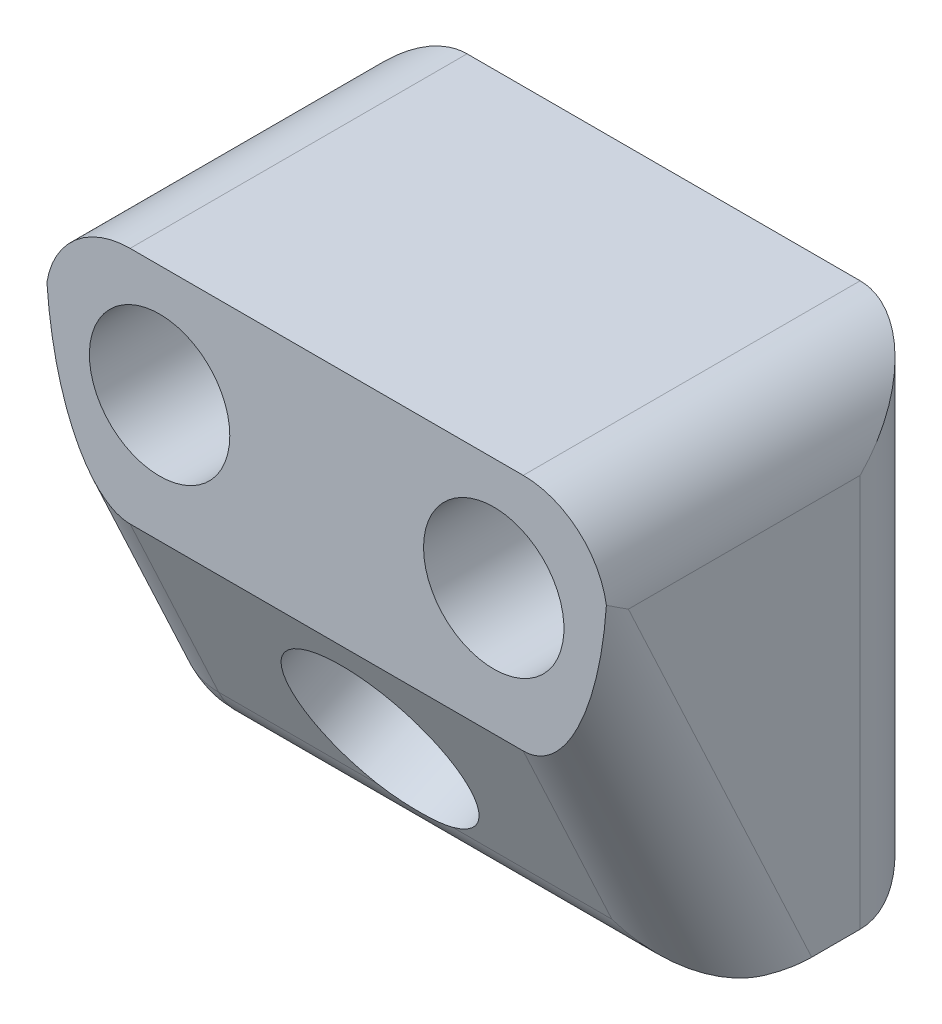
ISO-10303-21;
HEADER;
FILE_DESCRIPTION(('STEP AP214'),'2;1');
FILE_NAME('part.step','',(''),(''),'','','');
FILE_SCHEMA(('AUTOMOTIVE_DESIGN { 1 0 10303 214 1 1 1 1 }'));
ENDSEC;
DATA;
#1=APPLICATION_CONTEXT('core data for automotive mechanical design processes');
#2=APPLICATION_PROTOCOL_DEFINITION('international standard','automotive_design',2000,#1);
#3=PRODUCT_CONTEXT('',#1,'mechanical');
#4=PRODUCT('Part','Part','',(#3));
#5=PRODUCT_RELATED_PRODUCT_CATEGORY('part','',(#4));
#6=PRODUCT_DEFINITION_FORMATION('','',#4);
#7=PRODUCT_DEFINITION_CONTEXT('part definition',#1,'design');
#8=PRODUCT_DEFINITION('design','',#6,#7);
#9=PRODUCT_DEFINITION_SHAPE('','',#8);
#10=(LENGTH_UNIT() NAMED_UNIT(*) SI_UNIT(.MILLI.,.METRE.));
#11=(NAMED_UNIT(*) PLANE_ANGLE_UNIT() SI_UNIT($,.RADIAN.));
#12=(NAMED_UNIT(*) SI_UNIT($,.STERADIAN.) SOLID_ANGLE_UNIT());
#13=UNCERTAINTY_MEASURE_WITH_UNIT(LENGTH_MEASURE(1.E-05),#10,'distance_accuracy_value','');
#14=(GEOMETRIC_REPRESENTATION_CONTEXT(3) GLOBAL_UNCERTAINTY_ASSIGNED_CONTEXT((#13)) GLOBAL_UNIT_ASSIGNED_CONTEXT((#10,
#11,#12)) REPRESENTATION_CONTEXT('',''));
#15=CARTESIAN_POINT('',(0.,0.,0.));
#16=DIRECTION('',(0.,0.,1.));
#17=DIRECTION('',(1.,0.,0.));
#18=AXIS2_PLACEMENT_3D('',#15,#16,#17);
#19=CARTESIAN_POINT('',(0.,0.,0.));
#20=DIRECTION('',(0.,0.,1.));
#21=DIRECTION('',(1.,0.,0.));
#22=AXIS2_PLACEMENT_3D('',#19,#20,#21);
#23=PLANE('',#22);
#24=CARTESIAN_POINT('',(-40.4144473670726,10.6456692913386,0.));
#25=DIRECTION('',(0.,0.,1.));
#26=DIRECTION('',(1.,0.,0.));
#27=AXIS2_PLACEMENT_3D('',#24,#25,#26);
#28=CIRCLE('',#27,2.5);
#29=CARTESIAN_POINT('',(-41.4644473670726,8.37685903043088,0.));
#30=VERTEX_POINT('',#29);
#31=CARTESIAN_POINT('',(-41.4644473670726,12.9144795522463,0.));
#32=VERTEX_POINT('',#31);
#33=EDGE_CURVE('E230',#30,#32,#28,.T.);
#34=ORIENTED_EDGE('',*,*,#33,.T.);
#35=DIRECTION('',(0.,-1.,0.));
#36=VECTOR('',#35,1.);
#37=CARTESIAN_POINT('',(-41.4644473670726,0.,0.));
#38=LINE('',#37,#36);
#39=CARTESIAN_POINT('',(-41.4644473670726,14.6456692913386,0.));
#40=VERTEX_POINT('',#39);
#41=EDGE_CURVE('E278',#32,#40,#38,.F.);
#42=ORIENTED_EDGE('',*,*,#41,.T.);
#43=DIRECTION('',(-1.,0.,0.));
#44=VECTOR('',#43,1.);
#45=CARTESIAN_POINT('',(-44.4644473670726,14.6456692913386,0.));
#46=LINE('',#45,#44);
#47=CARTESIAN_POINT('',(-27.4644473670726,14.6456692913386,0.));
#48=VERTEX_POINT('',#47);
#49=EDGE_CURVE('E236',#48,#40,#46,.T.);
#50=ORIENTED_EDGE('',*,*,#49,.F.);
#51=DIRECTION('',(0.,1.,0.));
#52=VECTOR('',#51,1.);
#53=CARTESIAN_POINT('',(-27.4644473670726,0.,0.));
#54=LINE('',#53,#52);
#55=CARTESIAN_POINT('',(-27.4644473670726,12.9144795522463,0.));
#56=VERTEX_POINT('',#55);
#57=EDGE_CURVE('E276',#48,#56,#54,.F.);
#58=ORIENTED_EDGE('',*,*,#57,.T.);
#59=CARTESIAN_POINT('',(-28.5144473670726,10.6456692913386,0.));
#60=DIRECTION('',(0.,0.,1.));
#61=DIRECTION('',(-1.,0.,0.));
#62=AXIS2_PLACEMENT_3D('',#59,#60,#61);
#63=CIRCLE('',#62,2.5);
#64=CARTESIAN_POINT('',(-27.4644473670726,8.37685903043088,0.));
#65=VERTEX_POINT('',#64);
#66=EDGE_CURVE('E226',#56,#65,#63,.T.);
#67=ORIENTED_EDGE('',*,*,#66,.T.);
#68=DIRECTION('',(0.,1.,0.));
#69=VECTOR('',#68,1.);
#70=CARTESIAN_POINT('',(-27.4644473670726,0.,0.));
#71=LINE('',#70,#69);
#72=CARTESIAN_POINT('',(-27.4644473670726,0.645669291338572,0.));
#73=VERTEX_POINT('',#72);
#74=EDGE_CURVE('E269',#65,#73,#71,.F.);
#75=ORIENTED_EDGE('',*,*,#74,.T.);
#76=DIRECTION('',(1.,0.,0.));
#77=VECTOR('',#76,1.);
#78=CARTESIAN_POINT('',(0.,0.645669291338572,0.));
#79=LINE('',#78,#77);
#80=CARTESIAN_POINT('',(-41.4644473670726,0.645669291338572,0.));
#81=VERTEX_POINT('',#80);
#82=EDGE_CURVE('E271',#73,#81,#79,.F.);
#83=ORIENTED_EDGE('',*,*,#82,.T.);
#84=DIRECTION('',(0.,-1.,0.));
#85=VECTOR('',#84,1.);
#86=CARTESIAN_POINT('',(-41.4644473670726,0.,0.));
#87=LINE('',#86,#85);
#88=EDGE_CURVE('E274',#81,#30,#87,.F.);
#89=ORIENTED_EDGE('',*,*,#88,.T.);
#90=EDGE_LOOP('',(#34,#42,#50,#58,#67,#75,#83,#89));
#91=FACE_BOUND('',#90,.T.);
#92=DIRECTION('',(0.4636228302904,-0.886032658107769,0.));
#93=VECTOR('',#92,1.);
#94=CARTESIAN_POINT('',(-20.4655939879077,-10.7087662304812,0.));
#95=LINE('',#94,#93);
#96=CARTESIAN_POINT('',(-32.0395762364762,11.4103478135097,0.));
#97=VERTEX_POINT('',#96);
#98=CARTESIAN_POINT('',(-29.6147051058797,6.77616055386726,0.));
#99=VERTEX_POINT('',#98);
#100=EDGE_CURVE('E180',#97,#99,#95,.T.);
#101=ORIENTED_EDGE('',*,*,#100,.F.);
#102=DIRECTION('',(1.,0.,0.));
#103=VECTOR('',#102,1.);
#104=CARTESIAN_POINT('',(0.,11.4103478135097,0.));
#105=LINE('',#104,#103);
#106=CARTESIAN_POINT('',(-36.889318497669,11.4103478135097,0.));
#107=VERTEX_POINT('',#106);
#108=EDGE_CURVE('E246',#107,#97,#105,.T.);
#109=ORIENTED_EDGE('',*,*,#108,.F.);
#110=DIRECTION('',(0.463622830290399,0.88603265810777,0.));
#111=VECTOR('',#110,1.);
#112=CARTESIAN_POINT('',(-33.6473016629807,17.6061876341453,0.));
#113=LINE('',#112,#111);
#114=CARTESIAN_POINT('',(-39.3141896282654,6.77616055386726,0.));
#115=VERTEX_POINT('',#114);
#116=EDGE_CURVE('E250',#115,#107,#113,.T.);
#117=ORIENTED_EDGE('',*,*,#116,.F.);
#118=DIRECTION('',(-0.4636228302904,0.886032658107769,0.));
#119=VECTOR('',#118,1.);
#120=CARTESIAN_POINT('',(-28.0802118611763,-14.6931686762376,0.));
#121=LINE('',#120,#119);
#122=CARTESIAN_POINT('',(-36.889318497669,2.14197329422482,0.));
#123=VERTEX_POINT('',#122);
#124=EDGE_CURVE('E253',#123,#115,#121,.T.);
#125=ORIENTED_EDGE('',*,*,#124,.F.);
#126=DIRECTION('',(-1.,0.,0.));
#127=VECTOR('',#126,1.);
#128=CARTESIAN_POINT('',(0.,2.14197329422481,0.));
#129=LINE('',#128,#127);
#130=CARTESIAN_POINT('',(-32.0395762364762,2.14197329422481,0.));
#131=VERTEX_POINT('',#130);
#132=EDGE_CURVE('E255',#131,#123,#129,.T.);
#133=ORIENTED_EDGE('',*,*,#132,.F.);
#134=DIRECTION('',(-0.4636228302904,-0.886032658107769,0.));
#135=VECTOR('',#134,1.);
#136=CARTESIAN_POINT('',(-26.0326837897121,13.621785188389,0.));
#137=LINE('',#136,#135);
#138=EDGE_CURVE('E257',#99,#131,#137,.T.);
#139=ORIENTED_EDGE('',*,*,#138,.F.);
#140=EDGE_LOOP('',(#101,#109,#117,#125,#133,#139));
#141=FACE_BOUND('',#140,.T.);
#142=ADVANCED_FACE('F33',(#91,#141),#23,.F.);
#143=CARTESIAN_POINT('',(-34.4644473670726,10.5196494844875,-8.02793791856618));
#144=DIRECTION('',(0.,-0.422618261740694,0.906307787036653));
#145=DIRECTION('',(0.,-0.906307787036653,-0.422618261740694));
#146=AXIS2_PLACEMENT_3D('',#143,#144,#145);
#147=CYLINDRICAL_SURFACE('',#146,3.25);
#148=CARTESIAN_POINT('',(-34.4644473670726,2.06728424967364,10.0982178221669));
#149=DIRECTION('',(0.,0.422618261740694,-0.906307787036652));
#150=DIRECTION('',(0.,0.906307787036652,0.422618261740694));
#151=AXIS2_PLACEMENT_3D('',#148,#149,#150);
#152=CIRCLE('',#151,3.25);
#153=CARTESIAN_POINT('',(-35.7897528702737,-0.622185493883504,8.84409748437003));
#154=VERTEX_POINT('',#153);
#155=CARTESIAN_POINT('',(-33.1391418638715,-0.622185493883504,8.84409748437003));
#156=VERTEX_POINT('',#155);
#157=EDGE_CURVE('E220',#154,#156,#152,.T.);
#158=ORIENTED_EDGE('',*,*,#157,.F.);
#159=CARTESIAN_POINT('',(-35.7897528702737,-0.622185493883504,8.84409748437003));
#160=CARTESIAN_POINT('',(-35.7064009194639,-0.655922594509591,8.82833929196015));
#161=CARTESIAN_POINT('',(-35.6214796240061,-0.686185258662031,8.81348777113793));
#162=CARTESIAN_POINT('',(-35.449112774626,-0.739846043116224,8.78624370417459));
#163=CARTESIAN_POINT('',(-35.3616672861628,-0.763244341254242,8.77385109433274));
#164=CARTESIAN_POINT('',(-35.1848711780588,-0.803260407212151,8.75217071075625));
#165=CARTESIAN_POINT('',(-35.0955207550009,-0.819878871158265,8.74288261827988));
#166=CARTESIAN_POINT('',(-34.9155378865713,-0.846402142187462,8.72785702442064));
#167=CARTESIAN_POINT('',(-34.8249055019709,-0.85630726643452,8.72211935530322));
#168=CARTESIAN_POINT('',(-34.6429186086016,-0.869450606502847,8.71447309843761));
#169=CARTESIAN_POINT('',(-34.5515635430502,-0.872683048526374,8.71256782685684));
#170=CARTESIAN_POINT('',(-34.368863545242,-0.872476851743304,8.71268882138494));
#171=CARTESIAN_POINT('',(-34.2775186129831,-0.869038214373278,8.71471508664716));
#172=CARTESIAN_POINT('',(-34.0956073916761,-0.855484472837947,8.72259573927654));
#173=CARTESIAN_POINT('',(-34.0050402715182,-0.845377726095767,8.728445334617));
#174=CARTESIAN_POINT('',(-33.8252421581059,-0.818460124402204,8.74367773012892));
#175=CARTESIAN_POINT('',(-33.7360107028926,-0.80165164565734,8.75305927792435));
#176=CARTESIAN_POINT('',(-33.5606544843802,-0.761535448388546,8.77475834520401));
#177=CARTESIAN_POINT('',(-33.4745041654263,-0.738317340823053,8.78703506604438));
#178=CARTESIAN_POINT('',(-33.3047785162481,-0.685244722024231,8.81395001929086));
#179=CARTESIAN_POINT('',(-33.2211999770614,-0.655398897498184,8.8285851537848));
#180=CARTESIAN_POINT('',(-33.1391418638715,-0.622185493883509,8.84409748437004));
#181=B_SPLINE_CURVE_WITH_KNOTS('',3,(#159,#160,#161,#162,#163,#164,#165,#166,#167,#168,#169,
#170,#171,#172,#173,#174,#175,#176,#177,#178,#179,#180),.UNSPECIFIED.,.F.,.F.,(4,2,2,2,2,2,2,2,
2,2,4),(0.,0.273779855338668,0.547552617190878,0.821297262073434,1.09502897330499,
1.36899744242814,1.64296585255407,1.91659153714566,2.19012028951803,2.46000332048648,
2.72953469171393),.UNSPECIFIED.);
#182=EDGE_CURVE('E309',#154,#156,#181,.T.);
#183=ORIENTED_EDGE('',*,*,#182,.T.);
#184=EDGE_LOOP('',(#158,#183));
#185=FACE_BOUND('',#184,.T.);
#186=CARTESIAN_POINT('',(-34.4644473670726,3.75775729663641,6.47298667402026));
#187=DIRECTION('',(0.,0.422618261740694,-0.906307787036653));
#188=DIRECTION('',(0.,0.906307787036653,0.422618261740694));
#189=AXIS2_PLACEMENT_3D('',#186,#187,#188);
#190=CIRCLE('',#189,3.25);
#191=CARTESIAN_POINT('',(-34.4644473670726,6.70325760450553,7.84649602467752));
#192=VERTEX_POINT('',#191);
#193=EDGE_CURVE('E183',#192,#192,#190,.T.);
#194=ORIENTED_EDGE('',*,*,#193,.T.);
#195=EDGE_LOOP('',(#194));
#196=FACE_BOUND('',#195,.T.);
#197=ADVANCED_FACE('F324',(#185,#196),#147,.F.);
#198=CARTESIAN_POINT('',(0.,0.,12.));
#199=DIRECTION('',(0.,0.,1.));
#200=DIRECTION('',(1.,0.,0.));
#201=AXIS2_PLACEMENT_3D('',#198,#199,#200);
#202=PLANE('',#201);
#203=CARTESIAN_POINT('',(-41.4644473670726,11.6456692913386,12.));
#204=DIRECTION('',(0.,0.,1.));
#205=DIRECTION('',(1.,0.,0.));
#206=AXIS2_PLACEMENT_3D('',#203,#204,#205);
#207=CIRCLE('',#206,3.);
#208=CARTESIAN_POINT('',(-41.4644473670726,14.6456692913386,12.));
#209=VERTEX_POINT('',#208);
#210=CARTESIAN_POINT('',(-44.426620762828,12.1205679894612,12.));
#211=VERTEX_POINT('',#210);
#212=EDGE_CURVE('E293',#209,#211,#207,.T.);
#213=ORIENTED_EDGE('',*,*,#212,.T.);
#214=CARTESIAN_POINT('',(-41.4644473670726,13.2442740407962,12.));
#215=DIRECTION('',(0.,0.,1.));
#216=DIRECTION('',(0.,1.,0.));
#217=AXIS2_PLACEMENT_3D('',#214,#215,#216);
#218=ELLIPSE('',#217,7.09860474945759,3.);
#219=CARTESIAN_POINT('',(-41.4644473670726,6.14566929133857,12.));
#220=VERTEX_POINT('',#219);
#221=EDGE_CURVE('E295',#211,#220,#218,.T.);
#222=ORIENTED_EDGE('',*,*,#221,.T.);
#223=DIRECTION('',(1.,0.,0.));
#224=VECTOR('',#223,1.);
#225=CARTESIAN_POINT('',(-44.4644473670726,6.14566929133857,12.));
#226=LINE('',#225,#224);
#227=CARTESIAN_POINT('',(-27.4644473670726,6.14566929133857,12.));
#228=VERTEX_POINT('',#227);
#229=EDGE_CURVE('E223',#220,#228,#226,.T.);
#230=ORIENTED_EDGE('',*,*,#229,.T.);
#231=CARTESIAN_POINT('',(-27.4644473670726,13.2442740407962,12.));
#232=DIRECTION('',(0.,0.,1.));
#233=DIRECTION('',(0.,1.,0.));
#234=AXIS2_PLACEMENT_3D('',#231,#232,#233);
#235=ELLIPSE('',#234,7.09860474945759,3.);
#236=CARTESIAN_POINT('',(-24.5022739713171,12.1205679894612,12.));
#237=VERTEX_POINT('',#236);
#238=EDGE_CURVE('E291',#228,#237,#235,.T.);
#239=ORIENTED_EDGE('',*,*,#238,.T.);
#240=CARTESIAN_POINT('',(-27.4644473670726,11.6456692913386,12.));
#241=DIRECTION('',(0.,0.,1.));
#242=DIRECTION('',(1.,0.,0.));
#243=AXIS2_PLACEMENT_3D('',#240,#241,#242);
#244=CIRCLE('',#243,3.);
#245=CARTESIAN_POINT('',(-27.4644473670726,14.6456692913386,12.));
#246=VERTEX_POINT('',#245);
#247=EDGE_CURVE('E289',#237,#246,#244,.T.);
#248=ORIENTED_EDGE('',*,*,#247,.T.);
#249=DIRECTION('',(-1.,0.,0.));
#250=VECTOR('',#249,1.);
#251=CARTESIAN_POINT('',(-44.4644473670726,14.6456692913386,12.));
#252=LINE('',#251,#250);
#253=EDGE_CURVE('E239',#246,#209,#252,.T.);
#254=ORIENTED_EDGE('',*,*,#253,.T.);
#255=EDGE_LOOP('',(#213,#222,#230,#239,#248,#254));
#256=FACE_BOUND('',#255,.T.);
#257=CARTESIAN_POINT('',(-40.4144473670726,10.6456692913386,12.));
#258=DIRECTION('',(0.,0.,1.));
#259=DIRECTION('',(1.,0.,0.));
#260=AXIS2_PLACEMENT_3D('',#257,#258,#259);
#261=CIRCLE('',#260,2.5);
#262=CARTESIAN_POINT('',(-37.9144473670726,10.6456692913386,12.));
#263=VERTEX_POINT('',#262);
#264=EDGE_CURVE('E233',#263,#263,#261,.T.);
#265=ORIENTED_EDGE('',*,*,#264,.F.);
#266=EDGE_LOOP('',(#265));
#267=FACE_BOUND('',#266,.T.);
#268=CARTESIAN_POINT('',(-28.5144473670726,10.6456692913386,12.));
#269=DIRECTION('',(0.,0.,1.));
#270=DIRECTION('',(-1.,0.,0.));
#271=AXIS2_PLACEMENT_3D('',#268,#269,#270);
#272=CIRCLE('',#271,2.5);
#273=CARTESIAN_POINT('',(-31.0144473670726,10.6456692913386,12.));
#274=VERTEX_POINT('',#273);
#275=EDGE_CURVE('E227',#274,#274,#272,.T.);
#276=ORIENTED_EDGE('',*,*,#275,.F.);
#277=EDGE_LOOP('',(#276));
#278=FACE_BOUND('',#277,.T.);
#279=ADVANCED_FACE('F388',(#256,#267,#278),#202,.T.);
#280=CARTESIAN_POINT('',(-24.4644473670726,14.6456692913386,12.));
#281=DIRECTION('',(-1.,0.,0.));
#282=DIRECTION('',(0.,-1.,0.));
#283=AXIS2_PLACEMENT_3D('',#280,#281,#282);
#284=PLANE('',#283);
#285=DIRECTION('',(0.,0.,-1.));
#286=VECTOR('',#285,1.);
#287=CARTESIAN_POINT('',(-24.4644473670726,11.6456692913386,12.));
#288=LINE('',#287,#286);
#289=CARTESIAN_POINT('',(-24.4644473670726,11.6456692913386,3.));
#290=VERTEX_POINT('',#289);
#291=CARTESIAN_POINT('',(-24.4644473670726,11.6456692913386,11.254558362965));
#292=VERTEX_POINT('',#291);
#293=EDGE_CURVE('E50',#290,#292,#288,.F.);
#294=ORIENTED_EDGE('',*,*,#293,.T.);
#295=DIRECTION('',(0.,0.906307787036652,0.422618261740694));
#296=VECTOR('',#295,1.);
#297=CARTESIAN_POINT('',(-24.4644473670726,14.3953714177285,12.5367655221457));
#298=LINE('',#297,#296);
#299=CARTESIAN_POINT('',(-24.4644473670726,-2.35433070866143,4.72625114879511));
#300=VERTEX_POINT('',#299);
#301=EDGE_CURVE('E307',#292,#300,#298,.F.);
#302=ORIENTED_EDGE('',*,*,#301,.T.);
#303=DIRECTION('',(0.,0.,-1.));
#304=VECTOR('',#303,1.);
#305=CARTESIAN_POINT('',(-24.4644473670726,-2.35433070866143,12.));
#306=LINE('',#305,#304);
#307=CARTESIAN_POINT('',(-24.4644473670726,-2.35433070866143,3.));
#308=VERTEX_POINT('',#307);
#309=EDGE_CURVE('E242',#300,#308,#306,.T.);
#310=ORIENTED_EDGE('',*,*,#309,.T.);
#311=DIRECTION('',(0.,1.,0.));
#312=VECTOR('',#311,1.);
#313=CARTESIAN_POINT('',(-24.4644473670726,14.6456692913386,3.));
#314=LINE('',#313,#312);
#315=EDGE_CURVE('E55',#308,#290,#314,.T.);
#316=ORIENTED_EDGE('',*,*,#315,.T.);
#317=EDGE_LOOP('',(#294,#302,#310,#316));
#318=FACE_BOUND('',#317,.T.);
#319=ADVANCED_FACE('F391',(#318),#284,.F.);
#320=CARTESIAN_POINT('',(-44.4644473670726,14.6456692913386,12.));
#321=DIRECTION('',(0.,-1.,0.));
#322=DIRECTION('',(0.,0.,-1.));
#323=AXIS2_PLACEMENT_3D('',#320,#321,#322);
#324=PLANE('',#323);
#325=ORIENTED_EDGE('',*,*,#49,.T.);
#326=DIRECTION('',(0.,0.,-1.));
#327=VECTOR('',#326,1.);
#328=CARTESIAN_POINT('',(-41.4644473670726,14.6456692913386,12.));
#329=LINE('',#328,#327);
#330=EDGE_CURVE('E42',#40,#209,#329,.F.);
#331=ORIENTED_EDGE('',*,*,#330,.T.);
#332=ORIENTED_EDGE('',*,*,#253,.F.);
#333=DIRECTION('',(0.,0.,-1.));
#334=VECTOR('',#333,1.);
#335=CARTESIAN_POINT('',(-27.4644473670726,14.6456692913386,12.));
#336=LINE('',#335,#334);
#337=EDGE_CURVE('E633',#246,#48,#336,.T.);
#338=ORIENTED_EDGE('',*,*,#337,.T.);
#339=EDGE_LOOP('',(#325,#331,#332,#338));
#340=FACE_BOUND('',#339,.T.);
#341=ADVANCED_FACE('F402',(#340),#324,.F.);
#342=CARTESIAN_POINT('',(-44.4644473670726,14.6456692913386,12.));
#343=DIRECTION('',(1.,0.,0.));
#344=DIRECTION('',(0.,0.,-1.));
#345=AXIS2_PLACEMENT_3D('',#342,#343,#344);
#346=PLANE('',#345);
#347=DIRECTION('',(0.,-1.,0.));
#348=VECTOR('',#347,1.);
#349=CARTESIAN_POINT('',(-44.4644473670726,14.6456692913386,3.));
#350=LINE('',#349,#348);
#351=CARTESIAN_POINT('',(-44.4644473670726,11.6456692913386,3.));
#352=VERTEX_POINT('',#351);
#353=CARTESIAN_POINT('',(-44.4644473670726,0.645669291338572,3.));
#354=VERTEX_POINT('',#353);
#355=EDGE_CURVE('E282',#352,#354,#350,.T.);
#356=ORIENTED_EDGE('',*,*,#355,.T.);
#357=DIRECTION('',(0.,0.,-1.));
#358=VECTOR('',#357,1.);
#359=CARTESIAN_POINT('',(-44.4644473670726,0.645669291338571,12.));
#360=LINE('',#359,#358);
#361=CARTESIAN_POINT('',(-44.4644473670726,0.645669291338572,6.12517412326008));
#362=VERTEX_POINT('',#361);
#363=EDGE_CURVE('E286',#354,#362,#360,.F.);
#364=ORIENTED_EDGE('',*,*,#363,.T.);
#365=DIRECTION('',(0.,0.906307787036652,0.422618261740694));
#366=VECTOR('',#365,1.);
#367=CARTESIAN_POINT('',(-44.4644473670726,14.3953714177285,12.5367655221457));
#368=LINE('',#367,#366);
#369=CARTESIAN_POINT('',(-44.4644473670726,11.6456692913386,11.254558362965));
#370=VERTEX_POINT('',#369);
#371=EDGE_CURVE('E284',#362,#370,#368,.T.);
#372=ORIENTED_EDGE('',*,*,#371,.T.);
#373=DIRECTION('',(0.,0.,-1.));
#374=VECTOR('',#373,1.);
#375=CARTESIAN_POINT('',(-44.4644473670726,11.6456692913386,12.));
#376=LINE('',#375,#374);
#377=EDGE_CURVE('E280',#370,#352,#376,.T.);
#378=ORIENTED_EDGE('',*,*,#377,.T.);
#379=EDGE_LOOP('',(#356,#364,#372,#378));
#380=FACE_BOUND('',#379,.T.);
#381=ADVANCED_FACE('F398',(#380),#346,.F.);
#382=CARTESIAN_POINT('',(-44.4644473670726,-2.35433070866143,12.));
#383=DIRECTION('',(0.,1.,0.));
#384=DIRECTION('',(0.,0.,1.));
#385=AXIS2_PLACEMENT_3D('',#382,#383,#384);
#386=PLANE('',#385);
#387=DIRECTION('',(0.,0.,-1.));
#388=VECTOR('',#387,1.);
#389=CARTESIAN_POINT('',(-41.4644473670726,-2.35433070866143,12.));
#390=LINE('',#389,#388);
#391=CARTESIAN_POINT('',(-41.4644473670726,-2.35433070866143,6.12517412326008));
#392=VERTEX_POINT('',#391);
#393=CARTESIAN_POINT('',(-41.4644473670726,-2.35433070866143,3.));
#394=VERTEX_POINT('',#393);
#395=EDGE_CURVE('E264',#392,#394,#390,.T.);
#396=ORIENTED_EDGE('',*,*,#395,.T.);
#397=DIRECTION('',(1.,0.,0.));
#398=VECTOR('',#397,1.);
#399=CARTESIAN_POINT('',(-44.4644473670726,-2.35433070866143,3.));
#400=LINE('',#399,#398);
#401=EDGE_CURVE('E266',#394,#308,#400,.T.);
#402=ORIENTED_EDGE('',*,*,#401,.T.);
#403=ORIENTED_EDGE('',*,*,#309,.F.);
#404=CARTESIAN_POINT('',(-27.4644473670726,-2.35433070866143,4.72625114879511));
#405=DIRECTION('',(0.,1.,0.));
#406=DIRECTION('',(0.,0.,1.));
#407=AXIS2_PLACEMENT_3D('',#404,#405,#406);
#408=ELLIPSE('',#407,3.31013375688747,3.);
#409=CARTESIAN_POINT('',(-24.7455240059626,-2.35433070866143,6.12517412326008));
#410=VERTEX_POINT('',#409);
#411=EDGE_CURVE('E262',#300,#410,#408,.F.);
#412=ORIENTED_EDGE('',*,*,#411,.T.);
#413=DIRECTION('',(1.,0.,0.));
#414=VECTOR('',#413,1.);
#415=CARTESIAN_POINT('',(-44.4644473670726,-2.35433070866143,6.12517412326008));
#416=LINE('',#415,#414);
#417=EDGE_CURVE('E260',#410,#392,#416,.F.);
#418=ORIENTED_EDGE('',*,*,#417,.T.);
#419=EDGE_LOOP('',(#396,#402,#403,#412,#418));
#420=FACE_BOUND('',#419,.T.);
#421=ADVANCED_FACE('F386',(#420),#386,.F.);
#422=CARTESIAN_POINT('',(-40.4144473670726,10.6456692913386,12.));
#423=DIRECTION('',(0.,0.,-1.));
#424=DIRECTION('',(-1.,0.,0.));
#425=AXIS2_PLACEMENT_3D('',#422,#423,#424);
#426=CYLINDRICAL_SURFACE('',#425,2.5);
#427=ORIENTED_EDGE('',*,*,#264,.T.);
#428=EDGE_LOOP('',(#427));
#429=FACE_BOUND('',#428,.T.);
#430=ORIENTED_EDGE('',*,*,#33,.F.);
#431=CARTESIAN_POINT('',(-41.4644473670726,8.37685903043088,0.));
#432=CARTESIAN_POINT('',(-41.525013399962,8.40487545346007,-9.69502177451886E-06));
#433=CARTESIAN_POINT('',(-41.5844189508106,8.43532515334351,0.00183357259337167));
#434=CARTESIAN_POINT('',(-41.7004133823363,8.50074414376774,0.00873336024376356));
#435=CARTESIAN_POINT('',(-41.7570051952093,8.53570858671214,0.0137864562881625));
#436=CARTESIAN_POINT('',(-41.8666817279541,8.60965161645653,0.0265773245319816));
#437=CARTESIAN_POINT('',(-41.9197852239961,8.64860521801973,0.0342990287559989));
#438=CARTESIAN_POINT('',(-42.0225420254291,8.73037627783942,0.051907388542933));
#439=CARTESIAN_POINT('',(-42.0721944471121,8.77319471935088,0.0617945959499386));
#440=CARTESIAN_POINT('',(-42.2152072226572,8.90664674904311,0.0938231754860294));
#441=CARTESIAN_POINT('',(-42.3031343356031,9.00262405975606,0.118400385724673));
#442=CARTESIAN_POINT('',(-42.4629716244214,9.20677228000218,0.169799982596385));
#443=CARTESIAN_POINT('',(-42.5348468246378,9.31496905753151,0.196627100077903));
#444=CARTESIAN_POINT('',(-42.6670856452147,9.55218246878864,0.250595205036687));
#445=CARTESIAN_POINT('',(-42.7257566849622,9.68219956511392,0.277533287948673));
#446=CARTESIAN_POINT('',(-42.820365840609,9.95150151817694,0.323381735669483));
#447=CARTESIAN_POINT('',(-42.8563348880591,10.0907734777255,0.342303011796138));
#448=CARTESIAN_POINT('',(-42.9027385895123,10.367867053427,0.367131064212807));
#449=CARTESIAN_POINT('',(-42.9143035309613,10.5054440954311,0.373612607258208));
#450=CARTESIAN_POINT('',(-42.9145884102234,10.7806089784286,0.373767456412681));
#451=CARTESIAN_POINT('',(-42.9033148522919,10.9181968051915,0.367444409185594));
#452=CARTESIAN_POINT('',(-42.8608248700637,11.1753440181269,0.344701477137809));
#453=CARTESIAN_POINT('',(-42.8316669816389,11.2953504623857,0.329329692294486));
#454=CARTESIAN_POINT('',(-42.7564486315285,11.5288992840895,0.292144086699466));
#455=CARTESIAN_POINT('',(-42.710378907732,11.6424380799594,0.270326737183682));
#456=CARTESIAN_POINT('',(-42.5978212062416,11.8705975301638,0.221594583272989));
#457=CARTESIAN_POINT('',(-42.5299054241112,11.984452753219,0.194401423433916));
#458=CARTESIAN_POINT('',(-42.3767880849436,12.200250159283,0.14094395389291));
#459=CARTESIAN_POINT('',(-42.29157679065,12.3021855803449,0.114680177252396));
#460=CARTESIAN_POINT('',(-42.1102508280825,12.4868949795919,0.0689211650484147));
#461=CARTESIAN_POINT('',(-42.0149510484997,12.5703971912756,0.0491414417858552));
#462=CARTESIAN_POINT('',(-41.8119879420825,12.7224075221574,0.0184461523742538));
#463=CARTESIAN_POINT('',(-41.7043644281627,12.7909619572833,0.0075029128940143));
#464=CARTESIAN_POINT('',(-41.5711354742856,12.8621176728059,0.00182338134630271));
#465=CARTESIAN_POINT('',(-41.5500068611308,12.8730158805494,0.00114435416577155));
#466=CARTESIAN_POINT('',(-41.5074505176385,12.894203458147,0.000233166513845994));
#467=CARTESIAN_POINT('',(-41.4860229451137,12.9044931352398,7.78640933166862E-07));
#468=CARTESIAN_POINT('',(-41.4644473670726,12.9144795522463,0.));
#469=B_SPLINE_CURVE_WITH_KNOTS('',3,(#431,#432,#433,#434,#435,#436,#437,#438,#439,#440,#441,
#442,#443,#444,#445,#446,#447,#448,#449,#450,#451,#452,#453,#454,#455,#456,#457,#458,#459,#460,
#461,#462,#463,#464,#465,#466,#467,#468),.UNSPECIFIED.,.F.,.F.,(4,2,2,2,2,2,2,2,2,2,2,2,2,2,2,2,
2,2,4),(0.,0.200069982917405,0.399926904590149,0.598600848075627,0.797325479489738,
1.19293208523049,1.5893924494138,2.02272928530963,2.45547441624982,2.8676923464733,
3.27979289622743,3.65158454628271,4.02358012012482,4.42794285096798,4.83253386991519,
5.21572925420273,5.59771987489524,5.66906293277766,5.74036965749011),.UNSPECIFIED.);
#470=EDGE_CURVE('E316',#30,#32,#469,.T.);
#471=ORIENTED_EDGE('',*,*,#470,.T.);
#472=EDGE_LOOP('',(#430,#471));
#473=FACE_BOUND('',#472,.T.);
#474=ADVANCED_FACE('F381',(#429,#473),#426,.F.);
#475=CARTESIAN_POINT('',(-28.5144473670726,10.6456692913386,12.));
#476=DIRECTION('',(0.,0.,-1.));
#477=DIRECTION('',(-1.,0.,0.));
#478=AXIS2_PLACEMENT_3D('',#475,#476,#477);
#479=CYLINDRICAL_SURFACE('',#478,2.5);
#480=ORIENTED_EDGE('',*,*,#275,.T.);
#481=EDGE_LOOP('',(#480));
#482=FACE_BOUND('',#481,.T.);
#483=ORIENTED_EDGE('',*,*,#66,.F.);
#484=CARTESIAN_POINT('',(-27.4644473670726,12.9144795522463,0.));
#485=CARTESIAN_POINT('',(-27.4038813341831,12.8864631292171,-9.69502177555173E-06));
#486=CARTESIAN_POINT('',(-27.3444757833345,12.8560134293336,0.00183357259337091));
#487=CARTESIAN_POINT('',(-27.2284813518088,12.7905944389094,0.00873336024376386));
#488=CARTESIAN_POINT('',(-27.1718895389359,12.755629995965,0.0137864562881636));
#489=CARTESIAN_POINT('',(-27.062213006191,12.6816869662206,0.0265773245319826));
#490=CARTESIAN_POINT('',(-27.009109510149,12.6427333646574,0.0342990287559988));
#491=CARTESIAN_POINT('',(-26.9063527087161,12.5609623048377,0.051907388542932));
#492=CARTESIAN_POINT('',(-26.856700287033,12.5181438633263,0.061794595949938));
#493=CARTESIAN_POINT('',(-26.7136875114879,12.384691833634,0.0938231754860293));
#494=CARTESIAN_POINT('',(-26.6257603985421,12.2887145229211,0.118400385724672));
#495=CARTESIAN_POINT('',(-26.4659231097238,12.084566302675,0.169799982596384));
#496=CARTESIAN_POINT('',(-26.3940479095074,11.9763695251456,0.196627100077903));
#497=CARTESIAN_POINT('',(-26.2618090889304,11.7391561138885,0.250595205036687));
#498=CARTESIAN_POINT('',(-26.2031380491829,11.6091390175632,0.277533287948673));
#499=CARTESIAN_POINT('',(-26.1085288935362,11.3398370645002,0.323381735669483));
#500=CARTESIAN_POINT('',(-26.0725598460861,11.2005651049516,0.342303011796138));
#501=CARTESIAN_POINT('',(-26.0261561446329,10.9234715292502,0.367131064212806));
#502=CARTESIAN_POINT('',(-26.0145912031839,10.785894487246,0.373612607258207));
#503=CARTESIAN_POINT('',(-26.0143063239218,10.5107296042485,0.37376745641268));
#504=CARTESIAN_POINT('',(-26.0255798818533,10.3731417774856,0.367444409185594));
#505=CARTESIAN_POINT('',(-26.0680698640815,10.1159945645502,0.344701477137809));
#506=CARTESIAN_POINT('',(-26.0972277525062,9.99598812029144,0.329329692294486));
#507=CARTESIAN_POINT('',(-26.1724461026167,9.76243929858766,0.292144086699466));
#508=CARTESIAN_POINT('',(-26.2185158264131,9.64890050271776,0.270326737183682));
#509=CARTESIAN_POINT('',(-26.3310735279036,9.42074105251331,0.221594583272988));
#510=CARTESIAN_POINT('',(-26.398989310034,9.30688582945812,0.194401423433915));
#511=CARTESIAN_POINT('',(-26.5521066492015,9.0910884233941,0.140943953892909));
#512=CARTESIAN_POINT('',(-26.6373179434951,8.98915300233221,0.114680177252395));
#513=CARTESIAN_POINT('',(-26.8186439060627,8.80444360308525,0.0689211650484137));
#514=CARTESIAN_POINT('',(-26.9139436856454,8.72094139140157,0.0491414417858546));
#515=CARTESIAN_POINT('',(-27.1169067920626,8.56893106051976,0.018446152374254));
#516=CARTESIAN_POINT('',(-27.2245303059825,8.50037662539387,0.00750291289401483));
#517=CARTESIAN_POINT('',(-27.3577592598595,8.4292209098712,0.0018233813463024));
#518=CARTESIAN_POINT('',(-27.3788878730144,8.41832270212772,0.00114435416577104));
#519=CARTESIAN_POINT('',(-27.4214442165067,8.39713512453017,0.000233166513845412));
#520=CARTESIAN_POINT('',(-27.4428717890315,8.3868454474373,7.7864093269661E-07));
#521=CARTESIAN_POINT('',(-27.4644473670726,8.37685903043088,0.));
#522=B_SPLINE_CURVE_WITH_KNOTS('',3,(#484,#485,#486,#487,#488,#489,#490,#491,#492,#493,#494,
#495,#496,#497,#498,#499,#500,#501,#502,#503,#504,#505,#506,#507,#508,#509,#510,#511,#512,#513,
#514,#515,#516,#517,#518,#519,#520,#521),.UNSPECIFIED.,.F.,.F.,(4,2,2,2,2,2,2,2,2,2,2,2,2,2,2,2,
2,2,4),(0.,0.200069982917405,0.399926904590152,0.598600848075623,0.797325479489737,
1.19293208523049,1.58939244941379,2.02272928530963,2.45547441624982,2.8676923464733,
3.27979289622743,3.65158454628271,4.02358012012482,4.42794285096798,4.83253386991519,
5.21572925420273,5.59771987489523,5.66906293277767,5.74036965749012),.UNSPECIFIED.);
#523=EDGE_CURVE('E11',#56,#65,#522,.T.);
#524=ORIENTED_EDGE('',*,*,#523,.T.);
#525=EDGE_LOOP('',(#483,#524));
#526=FACE_BOUND('',#525,.T.);
#527=ADVANCED_FACE('F377',(#482,#526),#479,.F.);
#528=CARTESIAN_POINT('',(-44.4644473670726,6.14566929133857,12.));
#529=DIRECTION('',(0.,0.422618261740694,-0.906307787036652));
#530=DIRECTION('',(0.,0.906307787036652,0.422618261740694));
#531=AXIS2_PLACEMENT_3D('',#528,#529,#530);
#532=PLANE('',#531);
#533=ORIENTED_EDGE('',*,*,#229,.F.);
#534=DIRECTION('',(0.,0.906307787036652,0.422618261740694));
#535=VECTOR('',#534,1.);
#536=CARTESIAN_POINT('',(-41.4644473670726,6.14566929133857,12.));
#537=LINE('',#536,#535);
#538=CARTESIAN_POINT('',(-41.4644473670726,-0.62218549388351,8.84409748437004));
#539=VERTEX_POINT('',#538);
#540=EDGE_CURVE('E303',#220,#539,#537,.F.);
#541=ORIENTED_EDGE('',*,*,#540,.T.);
#542=DIRECTION('',(1.,0.,0.));
#543=VECTOR('',#542,1.);
#544=CARTESIAN_POINT('',(-44.4644473670726,-0.62218549388351,8.84409748437004));
#545=LINE('',#544,#543);
#546=EDGE_CURVE('E301',#539,#154,#545,.T.);
#547=ORIENTED_EDGE('',*,*,#546,.T.);
#548=ORIENTED_EDGE('',*,*,#157,.T.);
#549=DIRECTION('',(1.,0.,0.));
#550=VECTOR('',#549,1.);
#551=CARTESIAN_POINT('',(-44.4644473670726,-0.62218549388351,8.84409748437004));
#552=LINE('',#551,#550);
#553=CARTESIAN_POINT('',(-27.4644473670726,-0.62218549388351,8.84409748437004));
#554=VERTEX_POINT('',#553);
#555=EDGE_CURVE('E297',#156,#554,#552,.T.);
#556=ORIENTED_EDGE('',*,*,#555,.T.);
#557=DIRECTION('',(0.,0.906307787036652,0.422618261740694));
#558=VECTOR('',#557,1.);
#559=CARTESIAN_POINT('',(-27.4644473670726,6.14566929133857,12.));
#560=LINE('',#559,#558);
#561=EDGE_CURVE('E299',#554,#228,#560,.T.);
#562=ORIENTED_EDGE('',*,*,#561,.T.);
#563=EDGE_LOOP('',(#533,#541,#547,#548,#556,#562));
#564=FACE_BOUND('',#563,.T.);
#565=ADVANCED_FACE('F380',(#564),#532,.F.);
#566=CARTESIAN_POINT('',(-32.0395762364762,16.0166152370042,-9.87817236740188));
#567=DIRECTION('',(-0.866025403784439,-0.453153893518326,-0.211309130870347));
#568=DIRECTION('',(0.4636228302904,-0.886032658107769,0.));
#569=AXIS2_PLACEMENT_3D('',#566,#567,#568);
#570=PLANE('',#569);
#571=ORIENTED_EDGE('',*,*,#100,.T.);
#572=DIRECTION('',(0.,-0.422618261740694,0.906307787036653));
#573=VECTOR('',#572,1.);
#574=CARTESIAN_POINT('',(-29.6147051058797,12.2101225314503,-11.6531690667128));
#575=LINE('',#574,#573);
#576=CARTESIAN_POINT('',(-29.6147051058797,3.75775729663641,6.47298667402026));
#577=VERTEX_POINT('',#576);
#578=EDGE_CURVE('E173',#99,#577,#575,.T.);
#579=ORIENTED_EDGE('',*,*,#578,.T.);
#580=DIRECTION('',(0.5,-0.784885567221398,-0.365998150770662));
#581=VECTOR('',#580,1.);
#582=CARTESIAN_POINT('',(-32.0395762364762,7.56425000219035,8.24798337333117));
#583=LINE('',#582,#581);
#584=CARTESIAN_POINT('',(-32.0395762364762,7.56425000219035,8.24798337333117));
#585=VERTEX_POINT('',#584);
#586=EDGE_CURVE('E178',#585,#577,#583,.T.);
#587=ORIENTED_EDGE('',*,*,#586,.F.);
#588=DIRECTION('',(0.,-0.422618261740694,0.906307787036653));
#589=VECTOR('',#588,1.);
#590=CARTESIAN_POINT('',(-32.0395762364762,16.0166152370042,-9.87817236740188));
#591=LINE('',#590,#589);
#592=EDGE_CURVE('E211',#97,#585,#591,.T.);
#593=ORIENTED_EDGE('',*,*,#592,.F.);
#594=EDGE_LOOP('',(#571,#579,#587,#593));
#595=FACE_BOUND('',#594,.T.);
#596=ADVANCED_FACE('F175',(#595),#570,.T.);
#597=CARTESIAN_POINT('',(-29.6147051058797,12.2101225314503,-11.6531690667128));
#598=DIRECTION('',(-0.866025403784439,0.453153893518326,0.211309130870347));
#599=DIRECTION('',(-0.4636228302904,-0.886032658107769,0.));
#600=AXIS2_PLACEMENT_3D('',#597,#598,#599);
#601=PLANE('',#600);
#602=ORIENTED_EDGE('',*,*,#138,.T.);
#603=DIRECTION('',(0.,-0.422618261740694,0.906307787036653));
#604=VECTOR('',#603,1.);
#605=CARTESIAN_POINT('',(-32.0395762364762,8.40362982589635,-13.4281657660237));
#606=LINE('',#605,#604);
#607=CARTESIAN_POINT('',(-32.0395762364762,-0.0487354089175273,4.69798997470934));
#608=VERTEX_POINT('',#607);
#609=EDGE_CURVE('E184',#131,#608,#606,.T.);
#610=ORIENTED_EDGE('',*,*,#609,.T.);
#611=DIRECTION('',(-0.5,-0.784885567221398,-0.365998150770662));
#612=VECTOR('',#611,1.);
#613=CARTESIAN_POINT('',(-29.6147051058797,3.75775729663641,6.47298667402026));
#614=LINE('',#613,#612);
#615=EDGE_CURVE('E187',#577,#608,#614,.T.);
#616=ORIENTED_EDGE('',*,*,#615,.F.);
#617=ORIENTED_EDGE('',*,*,#578,.F.);
#618=EDGE_LOOP('',(#602,#610,#616,#617));
#619=FACE_BOUND('',#618,.T.);
#620=ADVANCED_FACE('F188',(#619),#601,.T.);
#621=CARTESIAN_POINT('',(-32.0395762364762,8.40362982589635,-13.4281657660237));
#622=DIRECTION('',(0.,0.906307787036653,0.422618261740694));
#623=DIRECTION('',(0.,-0.422618261740694,0.906307787036653));
#624=AXIS2_PLACEMENT_3D('',#621,#622,#623);
#625=PLANE('',#624);
#626=ORIENTED_EDGE('',*,*,#132,.T.);
#627=DIRECTION('',(0.,-0.422618261740694,0.906307787036653));
#628=VECTOR('',#627,1.);
#629=CARTESIAN_POINT('',(-36.889318497669,8.40362982589635,-13.4281657660237));
#630=LINE('',#629,#628);
#631=CARTESIAN_POINT('',(-36.889318497669,-0.0487354089175273,4.69798997470934));
#632=VERTEX_POINT('',#631);
#633=EDGE_CURVE('E217',#123,#632,#630,.T.);
#634=ORIENTED_EDGE('',*,*,#633,.T.);
#635=DIRECTION('',(-1.,0.,0.));
#636=VECTOR('',#635,1.);
#637=CARTESIAN_POINT('',(-32.0395762364762,-0.0487354089175273,4.69798997470934));
#638=LINE('',#637,#636);
#639=EDGE_CURVE('E193',#608,#632,#638,.T.);
#640=ORIENTED_EDGE('',*,*,#639,.F.);
#641=ORIENTED_EDGE('',*,*,#609,.F.);
#642=EDGE_LOOP('',(#626,#634,#640,#641));
#643=FACE_BOUND('',#642,.T.);
#644=ADVANCED_FACE('F450',(#643),#625,.T.);
#645=CARTESIAN_POINT('',(-36.889318497669,8.40362982589635,-13.4281657660237));
#646=DIRECTION('',(0.866025403784439,0.453153893518326,0.211309130870347));
#647=DIRECTION('',(-0.4636228302904,0.886032658107769,0.));
#648=AXIS2_PLACEMENT_3D('',#645,#646,#647);
#649=PLANE('',#648);
#650=ORIENTED_EDGE('',*,*,#124,.T.);
#651=DIRECTION('',(0.,-0.422618261740694,0.906307787036653));
#652=VECTOR('',#651,1.);
#653=CARTESIAN_POINT('',(-39.3141896282654,12.2101225314503,-11.6531690667128));
#654=LINE('',#653,#652);
#655=CARTESIAN_POINT('',(-39.3141896282654,3.75775729663641,6.47298667402026));
#656=VERTEX_POINT('',#655);
#657=EDGE_CURVE('E215',#115,#656,#654,.T.);
#658=ORIENTED_EDGE('',*,*,#657,.T.);
#659=DIRECTION('',(-0.5,0.784885567221398,0.365998150770662));
#660=VECTOR('',#659,1.);
#661=CARTESIAN_POINT('',(-36.889318497669,-0.0487354089175273,4.69798997470934));
#662=LINE('',#661,#660);
#663=EDGE_CURVE('E205',#632,#656,#662,.T.);
#664=ORIENTED_EDGE('',*,*,#663,.F.);
#665=ORIENTED_EDGE('',*,*,#633,.F.);
#666=EDGE_LOOP('',(#650,#658,#664,#665));
#667=FACE_BOUND('',#666,.T.);
#668=ADVANCED_FACE('F457',(#667),#649,.T.);
#669=CARTESIAN_POINT('',(-39.3141896282654,12.2101225314503,-11.6531690667128));
#670=DIRECTION('',(0.866025403784439,-0.453153893518325,-0.211309130870347));
#671=DIRECTION('',(0.463622830290399,0.88603265810777,0.));
#672=AXIS2_PLACEMENT_3D('',#669,#670,#671);
#673=PLANE('',#672);
#674=ORIENTED_EDGE('',*,*,#116,.T.);
#675=DIRECTION('',(0.,-0.422618261740694,0.906307787036653));
#676=VECTOR('',#675,1.);
#677=CARTESIAN_POINT('',(-36.889318497669,16.0166152370042,-9.87817236740188));
#678=LINE('',#677,#676);
#679=CARTESIAN_POINT('',(-36.889318497669,7.56425000219035,8.24798337333117));
#680=VERTEX_POINT('',#679);
#681=EDGE_CURVE('E213',#107,#680,#678,.T.);
#682=ORIENTED_EDGE('',*,*,#681,.T.);
#683=DIRECTION('',(0.499999999999999,0.784885567221399,0.365998150770662));
#684=VECTOR('',#683,1.);
#685=CARTESIAN_POINT('',(-39.3141896282654,3.75775729663641,6.47298667402026));
#686=LINE('',#685,#684);
#687=EDGE_CURVE('E208',#656,#680,#686,.T.);
#688=ORIENTED_EDGE('',*,*,#687,.F.);
#689=ORIENTED_EDGE('',*,*,#657,.F.);
#690=EDGE_LOOP('',(#674,#682,#688,#689));
#691=FACE_BOUND('',#690,.T.);
#692=ADVANCED_FACE('F465',(#691),#673,.T.);
#693=CARTESIAN_POINT('',(-36.889318497669,16.0166152370042,-9.87817236740188));
#694=DIRECTION('',(0.,-0.906307787036653,-0.422618261740694));
#695=DIRECTION('',(0.,0.422618261740694,-0.906307787036653));
#696=AXIS2_PLACEMENT_3D('',#693,#694,#695);
#697=PLANE('',#696);
#698=ORIENTED_EDGE('',*,*,#108,.T.);
#699=ORIENTED_EDGE('',*,*,#592,.T.);
#700=DIRECTION('',(1.,0.,0.));
#701=VECTOR('',#700,1.);
#702=CARTESIAN_POINT('',(-36.889318497669,7.56425000219035,8.24798337333117));
#703=LINE('',#702,#701);
#704=EDGE_CURVE('E199',#680,#585,#703,.T.);
#705=ORIENTED_EDGE('',*,*,#704,.F.);
#706=ORIENTED_EDGE('',*,*,#681,.F.);
#707=EDGE_LOOP('',(#698,#699,#705,#706));
#708=FACE_BOUND('',#707,.T.);
#709=ADVANCED_FACE('F473',(#708),#697,.T.);
#710=CARTESIAN_POINT('',(0.,-1.80813900293352,3.87756660503426));
#711=DIRECTION('',(0.,0.422618261740694,-0.906307787036653));
#712=DIRECTION('',(0.,0.906307787036653,0.422618261740694));
#713=AXIS2_PLACEMENT_3D('',#710,#711,#712);
#714=PLANE('',#713);
#715=ORIENTED_EDGE('',*,*,#193,.F.);
#716=EDGE_LOOP('',(#715));
#717=FACE_BOUND('',#716,.T.);
#718=ORIENTED_EDGE('',*,*,#586,.T.);
#719=ORIENTED_EDGE('',*,*,#615,.T.);
#720=ORIENTED_EDGE('',*,*,#639,.T.);
#721=ORIENTED_EDGE('',*,*,#663,.T.);
#722=ORIENTED_EDGE('',*,*,#687,.T.);
#723=ORIENTED_EDGE('',*,*,#704,.T.);
#724=EDGE_LOOP('',(#718,#719,#720,#721,#722,#723));
#725=FACE_BOUND('',#724,.T.);
#726=ADVANCED_FACE('F196',(#717,#725),#714,.T.);
#727=CARTESIAN_POINT('',(-41.4644473670726,14.3953714177285,12.5367655221457));
#728=DIRECTION('',(0.,0.906307787036652,0.422618261740694));
#729=DIRECTION('',(0.,-0.422618261740694,0.906307787036652));
#730=AXIS2_PLACEMENT_3D('',#727,#728,#729);
#731=CYLINDRICAL_SURFACE('',#730,3.);
#732=ORIENTED_EDGE('',*,*,#540,.F.);
#733=ORIENTED_EDGE('',*,*,#221,.F.);
#734=CARTESIAN_POINT('',(-41.4644473670726,11.6456692913386,11.254558362965));
#735=DIRECTION('',(0.,0.843391445812884,-0.537299608346826));
#736=DIRECTION('',(0.,-0.537299608346826,-0.843391445812884));
#737=AXIS2_PLACEMENT_3D('',#734,#735,#736);
#738=ELLIPSE('',#737,5.58347699011071,3.);
#739=EDGE_CURVE('E37',#370,#211,#738,.T.);
#740=ORIENTED_EDGE('',*,*,#739,.F.);
#741=ORIENTED_EDGE('',*,*,#371,.F.);
#742=CARTESIAN_POINT('',(-41.4644473670726,0.645669291338572,6.12517412326008));
#743=DIRECTION('',(0.,-0.906307787036653,-0.422618261740694));
#744=DIRECTION('',(0.,0.422618261740694,-0.906307787036653));
#745=AXIS2_PLACEMENT_3D('',#742,#743,#744);
#746=CIRCLE('',#745,3.);
#747=EDGE_CURVE('E202',#539,#362,#746,.T.);
#748=ORIENTED_EDGE('',*,*,#747,.F.);
#749=EDGE_LOOP('',(#732,#733,#740,#741,#748));
#750=FACE_BOUND('',#749,.T.);
#751=ADVANCED_FACE('F35',(#750),#731,.T.);
#752=CARTESIAN_POINT('',(-44.4644473670726,0.645669291338572,6.12517412326008));
#753=DIRECTION('',(1.,0.,0.));
#754=DIRECTION('',(0.,0.,-1.));
#755=AXIS2_PLACEMENT_3D('',#752,#753,#754);
#756=CYLINDRICAL_SURFACE('',#755,3.);
#757=ORIENTED_EDGE('',*,*,#182,.F.);
#758=ORIENTED_EDGE('',*,*,#546,.F.);
#759=CARTESIAN_POINT('',(-41.4644473670726,0.645669291338572,6.12517412326008));
#760=DIRECTION('',(-1.,0.,0.));
#761=DIRECTION('',(0.,0.,1.));
#762=AXIS2_PLACEMENT_3D('',#759,#760,#761);
#763=CIRCLE('',#762,3.);
#764=EDGE_CURVE('E651',#392,#539,#763,.T.);
#765=ORIENTED_EDGE('',*,*,#764,.F.);
#766=ORIENTED_EDGE('',*,*,#417,.F.);
#767=CARTESIAN_POINT('',(-27.4644473670726,0.645669291338572,6.12517412326008));
#768=DIRECTION('',(0.707106781186547,0.640856382055791,0.298836238730116));
#769=DIRECTION('',(0.707106781186547,-0.64085638205579,-0.298836238730116));
#770=AXIS2_PLACEMENT_3D('',#767,#768,#769);
#771=ELLIPSE('',#770,4.24264068711929,3.);
#772=EDGE_CURVE('E616',#554,#410,#771,.T.);
#773=ORIENTED_EDGE('',*,*,#772,.F.);
#774=ORIENTED_EDGE('',*,*,#555,.F.);
#775=EDGE_LOOP('',(#757,#758,#765,#766,#773,#774));
#776=FACE_BOUND('',#775,.T.);
#777=ADVANCED_FACE('F328',(#776),#756,.T.);
#778=CARTESIAN_POINT('',(-41.4644473670726,11.6456692913386,12.));
#779=DIRECTION('',(0.,0.,-1.));
#780=DIRECTION('',(-1.,0.,0.));
#781=AXIS2_PLACEMENT_3D('',#778,#779,#780);
#782=CYLINDRICAL_SURFACE('',#781,3.);
#783=ORIENTED_EDGE('',*,*,#212,.F.);
#784=ORIENTED_EDGE('',*,*,#330,.F.);
#785=CARTESIAN_POINT('',(-41.4644473670726,11.6456692913386,3.));
#786=DIRECTION('',(0.,-0.707106781186547,-0.707106781186547));
#787=DIRECTION('',(0.,0.707106781186547,-0.707106781186547));
#788=AXIS2_PLACEMENT_3D('',#785,#786,#787);
#789=ELLIPSE('',#788,4.24264068711928,3.);
#790=EDGE_CURVE('E647',#352,#40,#789,.T.);
#791=ORIENTED_EDGE('',*,*,#790,.F.);
#792=ORIENTED_EDGE('',*,*,#377,.F.);
#793=ORIENTED_EDGE('',*,*,#739,.T.);
#794=EDGE_LOOP('',(#783,#784,#791,#792,#793));
#795=FACE_BOUND('',#794,.T.);
#796=ADVANCED_FACE('F332',(#795),#782,.T.);
#797=CARTESIAN_POINT('',(-41.4644473670726,0.645669291338572,6.12517412326008));
#798=DIRECTION('',(0.,0.,1.));
#799=DIRECTION('',(1.,0.,0.));
#800=AXIS2_PLACEMENT_3D('',#797,#798,#799);
#801=SPHERICAL_SURFACE('',#800,3.);
#802=ORIENTED_EDGE('',*,*,#764,.T.);
#803=ORIENTED_EDGE('',*,*,#747,.T.);
#804=CARTESIAN_POINT('',(-41.4644473670726,0.645669291338572,6.12517412326008));
#805=DIRECTION('',(0.,0.,1.));
#806=DIRECTION('',(0.,-1.,0.));
#807=AXIS2_PLACEMENT_3D('',#804,#805,#806);
#808=CIRCLE('',#807,3.);
#809=EDGE_CURVE('E628',#392,#362,#808,.F.);
#810=ORIENTED_EDGE('',*,*,#809,.F.);
#811=EDGE_LOOP('',(#802,#803,#810));
#812=FACE_BOUND('',#811,.T.);
#813=ADVANCED_FACE('F336',(#812),#801,.T.);
#814=CARTESIAN_POINT('',(-27.4644473670726,7.41352407656065,9.28107663889004));
#815=DIRECTION('',(0.,0.906307787036652,0.422618261740694));
#816=DIRECTION('',(0.,-0.422618261740694,0.906307787036652));
#817=AXIS2_PLACEMENT_3D('',#814,#815,#816);
#818=CYLINDRICAL_SURFACE('',#817,3.);
#819=ORIENTED_EDGE('',*,*,#411,.F.);
#820=ORIENTED_EDGE('',*,*,#301,.F.);
#821=CARTESIAN_POINT('',(-27.4644473670726,11.6456692913386,11.254558362965));
#822=DIRECTION('',(0.,0.843391445812884,-0.537299608346826));
#823=DIRECTION('',(0.,0.537299608346826,0.843391445812884));
#824=AXIS2_PLACEMENT_3D('',#821,#822,#823);
#825=ELLIPSE('',#824,5.58347699011071,3.);
#826=EDGE_CURVE('E626',#237,#292,#825,.T.);
#827=ORIENTED_EDGE('',*,*,#826,.F.);
#828=ORIENTED_EDGE('',*,*,#238,.F.);
#829=ORIENTED_EDGE('',*,*,#561,.F.);
#830=ORIENTED_EDGE('',*,*,#772,.T.);
#831=EDGE_LOOP('',(#819,#820,#827,#828,#829,#830));
#832=FACE_BOUND('',#831,.T.);
#833=ADVANCED_FACE('F340',(#832),#818,.T.);
#834=CARTESIAN_POINT('',(-41.4644473670726,14.6456692913386,3.));
#835=DIRECTION('',(0.,-1.,0.));
#836=DIRECTION('',(0.,0.,-1.));
#837=AXIS2_PLACEMENT_3D('',#834,#835,#836);
#838=CYLINDRICAL_SURFACE('',#837,3.);
#839=ORIENTED_EDGE('',*,*,#470,.F.);
#840=ORIENTED_EDGE('',*,*,#88,.F.);
#841=CARTESIAN_POINT('',(-41.4644473670726,0.645669291338572,3.));
#842=DIRECTION('',(0.,-1.,0.));
#843=DIRECTION('',(0.,0.,-1.));
#844=AXIS2_PLACEMENT_3D('',#841,#842,#843);
#845=CIRCLE('',#844,3.);
#846=EDGE_CURVE('E629',#354,#81,#845,.T.);
#847=ORIENTED_EDGE('',*,*,#846,.F.);
#848=ORIENTED_EDGE('',*,*,#355,.F.);
#849=ORIENTED_EDGE('',*,*,#790,.T.);
#850=ORIENTED_EDGE('',*,*,#41,.F.);
#851=EDGE_LOOP('',(#839,#840,#847,#848,#849,#850));
#852=FACE_BOUND('',#851,.T.);
#853=ADVANCED_FACE('F343',(#852),#838,.T.);
#854=CARTESIAN_POINT('',(-41.4644473670726,0.645669291338572,12.));
#855=DIRECTION('',(0.,0.,-1.));
#856=DIRECTION('',(-1.,0.,0.));
#857=AXIS2_PLACEMENT_3D('',#854,#855,#856);
#858=CYLINDRICAL_SURFACE('',#857,3.);
#859=ORIENTED_EDGE('',*,*,#809,.T.);
#860=ORIENTED_EDGE('',*,*,#363,.F.);
#861=CARTESIAN_POINT('',(-41.4644473670726,0.645669291338572,3.));
#862=DIRECTION('',(0.,0.,-1.));
#863=DIRECTION('',(-1.,0.,0.));
#864=AXIS2_PLACEMENT_3D('',#861,#862,#863);
#865=CIRCLE('',#864,3.);
#866=EDGE_CURVE('E664',#394,#354,#865,.T.);
#867=ORIENTED_EDGE('',*,*,#866,.F.);
#868=ORIENTED_EDGE('',*,*,#395,.F.);
#869=EDGE_LOOP('',(#859,#860,#867,#868));
#870=FACE_BOUND('',#869,.T.);
#871=ADVANCED_FACE('F348',(#870),#858,.T.);
#872=CARTESIAN_POINT('',(-27.4644473670726,11.6456692913386,12.));
#873=DIRECTION('',(0.,0.,-1.));
#874=DIRECTION('',(-1.,0.,0.));
#875=AXIS2_PLACEMENT_3D('',#872,#873,#874);
#876=CYLINDRICAL_SURFACE('',#875,3.);
#877=ORIENTED_EDGE('',*,*,#826,.T.);
#878=ORIENTED_EDGE('',*,*,#293,.F.);
#879=CARTESIAN_POINT('',(-27.4644473670726,11.6456692913386,3.));
#880=DIRECTION('',(0.,0.707106781186547,0.707106781186547));
#881=DIRECTION('',(0.,0.707106781186547,-0.707106781186547));
#882=AXIS2_PLACEMENT_3D('',#879,#880,#881);
#883=ELLIPSE('',#882,4.24264068711928,3.);
#884=EDGE_CURVE('E670',#48,#290,#883,.F.);
#885=ORIENTED_EDGE('',*,*,#884,.F.);
#886=ORIENTED_EDGE('',*,*,#337,.F.);
#887=ORIENTED_EDGE('',*,*,#247,.F.);
#888=EDGE_LOOP('',(#877,#878,#885,#886,#887));
#889=FACE_BOUND('',#888,.T.);
#890=ADVANCED_FACE('F352',(#889),#876,.T.);
#891=CARTESIAN_POINT('',(-41.4644473670726,0.645669291338572,3.));
#892=DIRECTION('',(0.,0.,1.));
#893=DIRECTION('',(1.,0.,0.));
#894=AXIS2_PLACEMENT_3D('',#891,#892,#893);
#895=SPHERICAL_SURFACE('',#894,3.);
#896=ORIENTED_EDGE('',*,*,#866,.T.);
#897=ORIENTED_EDGE('',*,*,#846,.T.);
#898=CARTESIAN_POINT('',(-41.4644473670726,0.645669291338572,3.));
#899=DIRECTION('',(-1.,0.,0.));
#900=DIRECTION('',(0.,0.,1.));
#901=AXIS2_PLACEMENT_3D('',#898,#899,#900);
#902=CIRCLE('',#901,3.);
#903=EDGE_CURVE('E668',#394,#81,#902,.F.);
#904=ORIENTED_EDGE('',*,*,#903,.F.);
#905=EDGE_LOOP('',(#896,#897,#904));
#906=FACE_BOUND('',#905,.T.);
#907=ADVANCED_FACE('F356',(#906),#895,.T.);
#908=CARTESIAN_POINT('',(-27.4644473670726,14.6456692913386,3.));
#909=DIRECTION('',(0.,1.,0.));
#910=DIRECTION('',(-1.,0.,0.));
#911=AXIS2_PLACEMENT_3D('',#908,#909,#910);
#912=CYLINDRICAL_SURFACE('',#911,3.);
#913=ORIENTED_EDGE('',*,*,#884,.T.);
#914=ORIENTED_EDGE('',*,*,#315,.F.);
#915=CARTESIAN_POINT('',(-27.4644473670726,0.645669291338572,3.));
#916=DIRECTION('',(0.707106781186547,0.707106781186548,0.));
#917=DIRECTION('',(-0.707106781186548,0.707106781186547,0.));
#918=AXIS2_PLACEMENT_3D('',#915,#916,#917);
#919=ELLIPSE('',#918,4.24264068711929,3.);
#920=EDGE_CURVE('E375',#73,#308,#919,.F.);
#921=ORIENTED_EDGE('',*,*,#920,.F.);
#922=ORIENTED_EDGE('',*,*,#74,.F.);
#923=ORIENTED_EDGE('',*,*,#523,.F.);
#924=ORIENTED_EDGE('',*,*,#57,.F.);
#925=EDGE_LOOP('',(#913,#914,#921,#922,#923,#924));
#926=FACE_BOUND('',#925,.T.);
#927=ADVANCED_FACE('F360',(#926),#912,.T.);
#928=CARTESIAN_POINT('',(-44.4644473670726,0.645669291338572,3.));
#929=DIRECTION('',(1.,0.,0.));
#930=DIRECTION('',(0.,0.,-1.));
#931=AXIS2_PLACEMENT_3D('',#928,#929,#930);
#932=CYLINDRICAL_SURFACE('',#931,3.);
#933=ORIENTED_EDGE('',*,*,#903,.T.);
#934=ORIENTED_EDGE('',*,*,#82,.F.);
#935=ORIENTED_EDGE('',*,*,#920,.T.);
#936=ORIENTED_EDGE('',*,*,#401,.F.);
#937=EDGE_LOOP('',(#933,#934,#935,#936));
#938=FACE_BOUND('',#937,.T.);
#939=ADVANCED_FACE('F365',(#938),#932,.T.);
#940=CLOSED_SHELL('',(#142,#197,#279,#319,#341,#381,#421,#474,#527,#565,#596,#620,#644,#668,
#692,#709,#726,#751,#777,#796,#813,#833,#853,#871,#890,#907,#927,#939));
#941=MANIFOLD_SOLID_BREP('B2',#940);
#942=ADVANCED_BREP_SHAPE_REPRESENTATION('',(#18,#941),#14);
#943=SHAPE_DEFINITION_REPRESENTATION(#9,#942);
ENDSEC;
END-ISO-10303-21;
